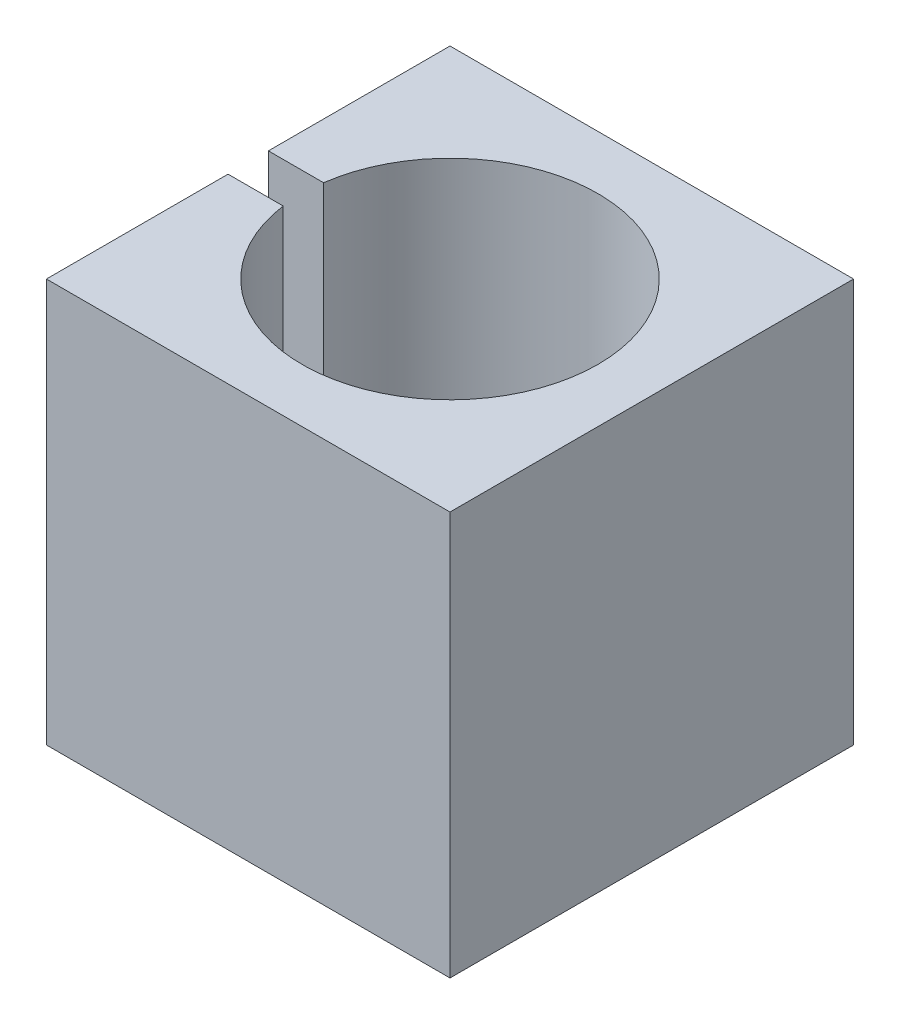
ISO-10303-21;
HEADER;
FILE_DESCRIPTION(('STEP AP214'),'2;1');
FILE_NAME('part.step','',(''),(''),'','','');
FILE_SCHEMA(('AUTOMOTIVE_DESIGN { 1 0 10303 214 1 1 1 1 }'));
ENDSEC;
DATA;
#1=APPLICATION_CONTEXT('core data for automotive mechanical design processes');
#2=APPLICATION_PROTOCOL_DEFINITION('international standard','automotive_design',2000,#1);
#3=PRODUCT_CONTEXT('',#1,'mechanical');
#4=PRODUCT('Part','Part','',(#3));
#5=PRODUCT_RELATED_PRODUCT_CATEGORY('part','',(#4));
#6=PRODUCT_DEFINITION_FORMATION('','',#4);
#7=PRODUCT_DEFINITION_CONTEXT('part definition',#1,'design');
#8=PRODUCT_DEFINITION('design','',#6,#7);
#9=PRODUCT_DEFINITION_SHAPE('','',#8);
#10=(LENGTH_UNIT() NAMED_UNIT(*) SI_UNIT(.MILLI.,.METRE.));
#11=(NAMED_UNIT(*) PLANE_ANGLE_UNIT() SI_UNIT($,.RADIAN.));
#12=(NAMED_UNIT(*) SI_UNIT($,.STERADIAN.) SOLID_ANGLE_UNIT());
#13=UNCERTAINTY_MEASURE_WITH_UNIT(LENGTH_MEASURE(1.E-05),#10,'distance_accuracy_value','');
#14=(GEOMETRIC_REPRESENTATION_CONTEXT(3) GLOBAL_UNCERTAINTY_ASSIGNED_CONTEXT((#13)) GLOBAL_UNIT_ASSIGNED_CONTEXT((#10,
#11,#12)) REPRESENTATION_CONTEXT('',''));
#15=CARTESIAN_POINT('',(0.,0.,0.));
#16=DIRECTION('',(0.,0.,1.));
#17=DIRECTION('',(1.,0.,0.));
#18=AXIS2_PLACEMENT_3D('',#15,#16,#17);
#19=CARTESIAN_POINT('',(0.359281437125746,30.,8.48802395209581));
#20=DIRECTION('',(0.,-1.,0.));
#21=DIRECTION('',(0.,0.,-1.));
#22=AXIS2_PLACEMENT_3D('',#19,#20,#21);
#23=CYLINDRICAL_SURFACE('',#22,11.);
#24=DIRECTION('',(0.,-1.,0.));
#25=VECTOR('',#24,1.);
#26=CARTESIAN_POINT('',(-10.5379659217259,30.,6.98802395209581));
#27=LINE('',#26,#25);
#28=CARTESIAN_POINT('',(-10.5379659217259,30.,6.98802395209581));
#29=VERTEX_POINT('',#28);
#30=CARTESIAN_POINT('',(-10.5379659217259,4.99999999999998,6.98802395209581));
#31=VERTEX_POINT('',#30);
#32=EDGE_CURVE('E41',#29,#31,#27,.T.);
#33=ORIENTED_EDGE('',*,*,#32,.T.);
#34=CARTESIAN_POINT('',(0.359281437125746,4.99999999999998,8.48802395209581));
#35=DIRECTION('',(0.,-1.,0.));
#36=DIRECTION('',(0.,0.,-1.));
#37=AXIS2_PLACEMENT_3D('',#34,#35,#36);
#38=CIRCLE('',#37,11.);
#39=CARTESIAN_POINT('',(-10.5379659217259,4.99999999999998,9.98802395209581));
#40=VERTEX_POINT('',#39);
#41=EDGE_CURVE('E114',#31,#40,#38,.T.);
#42=ORIENTED_EDGE('',*,*,#41,.T.);
#43=DIRECTION('',(0.,-1.,0.));
#44=VECTOR('',#43,1.);
#45=CARTESIAN_POINT('',(-10.5379659217259,30.,9.98802395209581));
#46=LINE('',#45,#44);
#47=CARTESIAN_POINT('',(-10.5379659217259,30.,9.98802395209581));
#48=VERTEX_POINT('',#47);
#49=EDGE_CURVE('E118',#48,#40,#46,.T.);
#50=ORIENTED_EDGE('',*,*,#49,.F.);
#51=CARTESIAN_POINT('',(0.359281437125746,30.,8.48802395209581));
#52=DIRECTION('',(0.,1.,0.));
#53=DIRECTION('',(0.,0.,1.));
#54=AXIS2_PLACEMENT_3D('',#51,#52,#53);
#55=CIRCLE('',#54,11.);
#56=EDGE_CURVE('E128',#48,#29,#55,.T.);
#57=ORIENTED_EDGE('',*,*,#56,.T.);
#58=EDGE_LOOP('',(#33,#42,#50,#57));
#59=FACE_BOUND('',#58,.T.);
#60=ADVANCED_FACE('F33',(#59),#23,.F.);
#61=CARTESIAN_POINT('',(-3.64071856287427,0.,9.9880239520958));
#62=DIRECTION('',(0.,0.,1.));
#63=DIRECTION('',(1.,0.,0.));
#64=AXIS2_PLACEMENT_3D('',#61,#62,#63);
#65=PLANE('',#64);
#66=DIRECTION('',(1.,0.,0.));
#67=VECTOR('',#66,1.);
#68=CARTESIAN_POINT('',(-3.64071856287427,4.99999999999998,9.9880239520958));
#69=LINE('',#68,#67);
#70=CARTESIAN_POINT('',(-14.6407185628743,4.99999999999998,9.98802395209581));
#71=VERTEX_POINT('',#70);
#72=EDGE_CURVE('E110',#71,#40,#69,.T.);
#73=ORIENTED_EDGE('',*,*,#72,.F.);
#74=DIRECTION('',(0.,1.,0.));
#75=VECTOR('',#74,1.);
#76=CARTESIAN_POINT('',(-14.6407185628743,0.,9.98802395209581));
#77=LINE('',#76,#75);
#78=CARTESIAN_POINT('',(-14.6407185628743,30.,9.98802395209581));
#79=VERTEX_POINT('',#78);
#80=EDGE_CURVE('E117',#71,#79,#77,.T.);
#81=ORIENTED_EDGE('',*,*,#80,.T.);
#82=DIRECTION('',(-1.,0.,0.));
#83=VECTOR('',#82,1.);
#84=CARTESIAN_POINT('',(-3.64071856287427,30.,9.9880239520958));
#85=LINE('',#84,#83);
#86=EDGE_CURVE('E48',#48,#79,#85,.T.);
#87=ORIENTED_EDGE('',*,*,#86,.F.);
#88=ORIENTED_EDGE('',*,*,#49,.T.);
#89=EDGE_LOOP('',(#73,#81,#87,#88));
#90=FACE_BOUND('',#89,.T.);
#91=ADVANCED_FACE('F116',(#90),#65,.F.);
#92=CARTESIAN_POINT('',(-3.64071856287427,0.,6.98802395209581));
#93=DIRECTION('',(0.,0.,1.));
#94=DIRECTION('',(1.,0.,0.));
#95=AXIS2_PLACEMENT_3D('',#92,#93,#94);
#96=PLANE('',#95);
#97=DIRECTION('',(0.,1.,0.));
#98=VECTOR('',#97,1.);
#99=CARTESIAN_POINT('',(-14.6407185628743,0.,6.98802395209581));
#100=LINE('',#99,#98);
#101=CARTESIAN_POINT('',(-14.6407185628743,4.99999999999998,6.98802395209581));
#102=VERTEX_POINT('',#101);
#103=CARTESIAN_POINT('',(-14.6407185628743,30.,6.98802395209581));
#104=VERTEX_POINT('',#103);
#105=EDGE_CURVE('E119',#102,#104,#100,.T.);
#106=ORIENTED_EDGE('',*,*,#105,.F.);
#107=DIRECTION('',(1.,0.,0.));
#108=VECTOR('',#107,1.);
#109=CARTESIAN_POINT('',(-3.64071856287427,4.99999999999998,6.98802395209581));
#110=LINE('',#109,#108);
#111=EDGE_CURVE('E11',#102,#31,#110,.T.);
#112=ORIENTED_EDGE('',*,*,#111,.T.);
#113=ORIENTED_EDGE('',*,*,#32,.F.);
#114=DIRECTION('',(-1.,0.,0.));
#115=VECTOR('',#114,1.);
#116=CARTESIAN_POINT('',(-3.64071856287427,30.,6.98802395209581));
#117=LINE('',#116,#115);
#118=EDGE_CURVE('E123',#29,#104,#117,.T.);
#119=ORIENTED_EDGE('',*,*,#118,.T.);
#120=EDGE_LOOP('',(#106,#112,#113,#119));
#121=FACE_BOUND('',#120,.T.);
#122=ADVANCED_FACE('F161',(#121),#96,.T.);
#123=CARTESIAN_POINT('',(0.,30.,0.));
#124=DIRECTION('',(0.,1.,0.));
#125=DIRECTION('',(0.,0.,1.));
#126=AXIS2_PLACEMENT_3D('',#123,#124,#125);
#127=PLANE('',#126);
#128=DIRECTION('',(0.,0.,1.));
#129=VECTOR('',#128,1.);
#130=CARTESIAN_POINT('',(-14.6407185628743,30.,-6.51197604790419));
#131=LINE('',#130,#129);
#132=CARTESIAN_POINT('',(-14.6407185628743,30.,-6.51197604790419));
#133=VERTEX_POINT('',#132);
#134=EDGE_CURVE('E133',#133,#104,#131,.T.);
#135=ORIENTED_EDGE('',*,*,#134,.T.);
#136=ORIENTED_EDGE('',*,*,#118,.F.);
#137=ORIENTED_EDGE('',*,*,#56,.F.);
#138=ORIENTED_EDGE('',*,*,#86,.T.);
#139=CARTESIAN_POINT('',(-14.6407185628743,30.,23.4880239520958));
#140=VERTEX_POINT('',#139);
#141=EDGE_CURVE('E84',#79,#140,#131,.T.);
#142=ORIENTED_EDGE('',*,*,#141,.T.);
#143=DIRECTION('',(1.,0.,0.));
#144=VECTOR('',#143,1.);
#145=CARTESIAN_POINT('',(-14.6407185628743,30.,23.4880239520958));
#146=LINE('',#145,#144);
#147=CARTESIAN_POINT('',(15.3592814371258,30.,23.4880239520958));
#148=VERTEX_POINT('',#147);
#149=EDGE_CURVE('E135',#140,#148,#146,.T.);
#150=ORIENTED_EDGE('',*,*,#149,.T.);
#151=DIRECTION('',(0.,0.,-1.));
#152=VECTOR('',#151,1.);
#153=CARTESIAN_POINT('',(15.3592814371257,30.,-6.51197604790419));
#154=LINE('',#153,#152);
#155=CARTESIAN_POINT('',(15.3592814371257,30.,-6.51197604790419));
#156=VERTEX_POINT('',#155);
#157=EDGE_CURVE('E137',#148,#156,#154,.T.);
#158=ORIENTED_EDGE('',*,*,#157,.T.);
#159=DIRECTION('',(-1.,0.,0.));
#160=VECTOR('',#159,1.);
#161=CARTESIAN_POINT('',(-14.6407185628743,30.,-6.51197604790419));
#162=LINE('',#161,#160);
#163=EDGE_CURVE('E57',#156,#133,#162,.T.);
#164=ORIENTED_EDGE('',*,*,#163,.T.);
#165=EDGE_LOOP('',(#135,#136,#137,#138,#142,#150,#158,#164));
#166=FACE_BOUND('',#165,.T.);
#167=ADVANCED_FACE('F162',(#166),#127,.T.);
#168=CARTESIAN_POINT('',(0.,0.,0.));
#169=DIRECTION('',(0.,1.,0.));
#170=DIRECTION('',(0.,0.,1.));
#171=AXIS2_PLACEMENT_3D('',#168,#169,#170);
#172=PLANE('',#171);
#173=DIRECTION('',(1.,0.,0.));
#174=VECTOR('',#173,1.);
#175=CARTESIAN_POINT('',(-14.6407185628743,0.,23.4880239520958));
#176=LINE('',#175,#174);
#177=CARTESIAN_POINT('',(-14.6407185628743,0.,23.4880239520958));
#178=VERTEX_POINT('',#177);
#179=CARTESIAN_POINT('',(15.3592814371258,0.,23.4880239520958));
#180=VERTEX_POINT('',#179);
#181=EDGE_CURVE('E141',#178,#180,#176,.T.);
#182=ORIENTED_EDGE('',*,*,#181,.F.);
#183=DIRECTION('',(0.,0.,1.));
#184=VECTOR('',#183,1.);
#185=CARTESIAN_POINT('',(-14.6407185628743,0.,-6.51197604790419));
#186=LINE('',#185,#184);
#187=CARTESIAN_POINT('',(-14.6407185628743,0.,-6.51197604790419));
#188=VERTEX_POINT('',#187);
#189=EDGE_CURVE('E132',#188,#178,#186,.T.);
#190=ORIENTED_EDGE('',*,*,#189,.F.);
#191=DIRECTION('',(-1.,0.,0.));
#192=VECTOR('',#191,1.);
#193=CARTESIAN_POINT('',(-14.6407185628743,0.,-6.51197604790419));
#194=LINE('',#193,#192);
#195=CARTESIAN_POINT('',(15.3592814371257,0.,-6.51197604790419));
#196=VERTEX_POINT('',#195);
#197=EDGE_CURVE('E147',#196,#188,#194,.T.);
#198=ORIENTED_EDGE('',*,*,#197,.F.);
#199=DIRECTION('',(0.,0.,-1.));
#200=VECTOR('',#199,1.);
#201=CARTESIAN_POINT('',(15.3592814371257,0.,-6.51197604790419));
#202=LINE('',#201,#200);
#203=EDGE_CURVE('E144',#180,#196,#202,.T.);
#204=ORIENTED_EDGE('',*,*,#203,.F.);
#205=EDGE_LOOP('',(#182,#190,#198,#204));
#206=FACE_BOUND('',#205,.T.);
#207=ADVANCED_FACE('F164',(#206),#172,.F.);
#208=CARTESIAN_POINT('',(-14.6407185628743,30.,-6.51197604790419));
#209=DIRECTION('',(1.,0.,0.));
#210=DIRECTION('',(0.,0.,-1.));
#211=AXIS2_PLACEMENT_3D('',#208,#209,#210);
#212=PLANE('',#211);
#213=ORIENTED_EDGE('',*,*,#189,.T.);
#214=DIRECTION('',(0.,-1.,0.));
#215=VECTOR('',#214,1.);
#216=CARTESIAN_POINT('',(-14.6407185628743,30.,23.4880239520958));
#217=LINE('',#216,#215);
#218=EDGE_CURVE('E154',#140,#178,#217,.T.);
#219=ORIENTED_EDGE('',*,*,#218,.F.);
#220=ORIENTED_EDGE('',*,*,#141,.F.);
#221=ORIENTED_EDGE('',*,*,#80,.F.);
#222=DIRECTION('',(0.,0.,-1.));
#223=VECTOR('',#222,1.);
#224=CARTESIAN_POINT('',(-14.6407185628743,4.99999999999998,23.4880239520958));
#225=LINE('',#224,#223);
#226=EDGE_CURVE('E107',#71,#102,#225,.T.);
#227=ORIENTED_EDGE('',*,*,#226,.T.);
#228=ORIENTED_EDGE('',*,*,#105,.T.);
#229=ORIENTED_EDGE('',*,*,#134,.F.);
#230=DIRECTION('',(0.,-1.,0.));
#231=VECTOR('',#230,1.);
#232=CARTESIAN_POINT('',(-14.6407185628743,30.,-6.51197604790419));
#233=LINE('',#232,#231);
#234=EDGE_CURVE('E78',#133,#188,#233,.T.);
#235=ORIENTED_EDGE('',*,*,#234,.T.);
#236=EDGE_LOOP('',(#213,#219,#220,#221,#227,#228,#229,#235));
#237=FACE_BOUND('',#236,.T.);
#238=ADVANCED_FACE('F35',(#237),#212,.F.);
#239=CARTESIAN_POINT('',(-14.6407185628743,30.,23.4880239520958));
#240=DIRECTION('',(0.,0.,-1.));
#241=DIRECTION('',(-1.,0.,0.));
#242=AXIS2_PLACEMENT_3D('',#239,#240,#241);
#243=PLANE('',#242);
#244=ORIENTED_EDGE('',*,*,#181,.T.);
#245=DIRECTION('',(0.,-1.,0.));
#246=VECTOR('',#245,1.);
#247=CARTESIAN_POINT('',(15.3592814371258,30.,23.4880239520958));
#248=LINE('',#247,#246);
#249=EDGE_CURVE('E152',#148,#180,#248,.T.);
#250=ORIENTED_EDGE('',*,*,#249,.F.);
#251=ORIENTED_EDGE('',*,*,#149,.F.);
#252=ORIENTED_EDGE('',*,*,#218,.T.);
#253=EDGE_LOOP('',(#244,#250,#251,#252));
#254=FACE_BOUND('',#253,.T.);
#255=ADVANCED_FACE('F191',(#254),#243,.F.);
#256=CARTESIAN_POINT('',(15.3592814371257,30.,-6.51197604790419));
#257=DIRECTION('',(-1.,0.,0.));
#258=DIRECTION('',(0.,0.,1.));
#259=AXIS2_PLACEMENT_3D('',#256,#257,#258);
#260=PLANE('',#259);
#261=ORIENTED_EDGE('',*,*,#203,.T.);
#262=DIRECTION('',(0.,-1.,0.));
#263=VECTOR('',#262,1.);
#264=CARTESIAN_POINT('',(15.3592814371257,30.,-6.51197604790419));
#265=LINE('',#264,#263);
#266=EDGE_CURVE('E150',#156,#196,#265,.T.);
#267=ORIENTED_EDGE('',*,*,#266,.F.);
#268=ORIENTED_EDGE('',*,*,#157,.F.);
#269=ORIENTED_EDGE('',*,*,#249,.T.);
#270=EDGE_LOOP('',(#261,#267,#268,#269));
#271=FACE_BOUND('',#270,.T.);
#272=ADVANCED_FACE('F185',(#271),#260,.F.);
#273=CARTESIAN_POINT('',(-14.6407185628743,30.,-6.51197604790419));
#274=DIRECTION('',(0.,0.,1.));
#275=DIRECTION('',(1.,0.,0.));
#276=AXIS2_PLACEMENT_3D('',#273,#274,#275);
#277=PLANE('',#276);
#278=ORIENTED_EDGE('',*,*,#197,.T.);
#279=ORIENTED_EDGE('',*,*,#234,.F.);
#280=ORIENTED_EDGE('',*,*,#163,.F.);
#281=ORIENTED_EDGE('',*,*,#266,.T.);
#282=EDGE_LOOP('',(#278,#279,#280,#281));
#283=FACE_BOUND('',#282,.T.);
#284=ADVANCED_FACE('F181',(#283),#277,.F.);
#285=CARTESIAN_POINT('',(0.,4.99999999999998,0.));
#286=DIRECTION('',(0.,-1.,0.));
#287=DIRECTION('',(0.,0.,-1.));
#288=AXIS2_PLACEMENT_3D('',#285,#286,#287);
#289=PLANE('',#288);
#290=ORIENTED_EDGE('',*,*,#226,.F.);
#291=ORIENTED_EDGE('',*,*,#72,.T.);
#292=ORIENTED_EDGE('',*,*,#41,.F.);
#293=ORIENTED_EDGE('',*,*,#111,.F.);
#294=EDGE_LOOP('',(#290,#291,#292,#293));
#295=FACE_BOUND('',#294,.T.);
#296=ADVANCED_FACE('F109',(#295),#289,.F.);
#297=CLOSED_SHELL('',(#60,#91,#122,#167,#207,#238,#255,#272,#284,#296));
#298=MANIFOLD_SOLID_BREP('B2',#297);
#299=ADVANCED_BREP_SHAPE_REPRESENTATION('',(#18,#298),#14);
#300=SHAPE_DEFINITION_REPRESENTATION(#9,#299);
ENDSEC;
END-ISO-10303-21;
